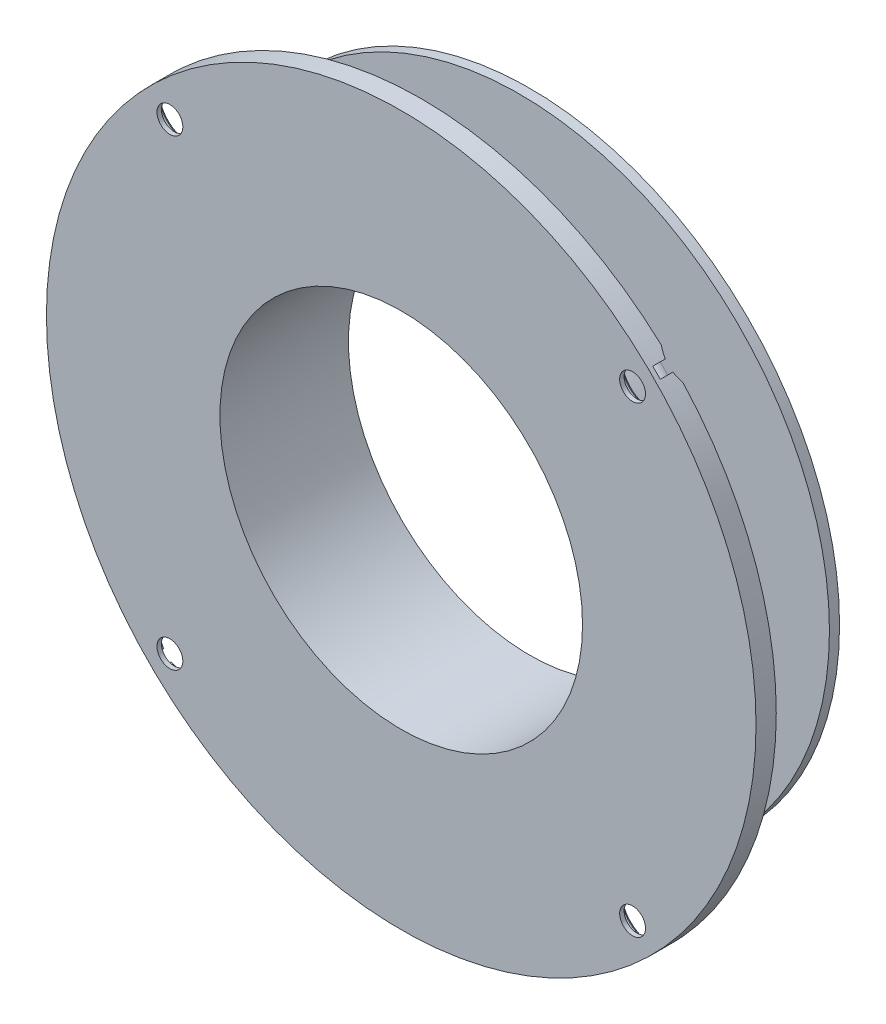
ISO-10303-21;
HEADER;
FILE_DESCRIPTION(('STEP AP214'),'2;1');
FILE_NAME('part.step','',(''),(''),'','','');
FILE_SCHEMA(('AUTOMOTIVE_DESIGN { 1 0 10303 214 1 1 1 1 }'));
ENDSEC;
DATA;
#1=APPLICATION_CONTEXT('core data for automotive mechanical design processes');
#2=APPLICATION_PROTOCOL_DEFINITION('international standard','automotive_design',2000,#1);
#3=PRODUCT_CONTEXT('',#1,'mechanical');
#4=PRODUCT('Part','Part','',(#3));
#5=PRODUCT_RELATED_PRODUCT_CATEGORY('part','',(#4));
#6=PRODUCT_DEFINITION_FORMATION('','',#4);
#7=PRODUCT_DEFINITION_CONTEXT('part definition',#1,'design');
#8=PRODUCT_DEFINITION('design','',#6,#7);
#9=PRODUCT_DEFINITION_SHAPE('','',#8);
#10=(LENGTH_UNIT() NAMED_UNIT(*) SI_UNIT(.MILLI.,.METRE.));
#11=(NAMED_UNIT(*) PLANE_ANGLE_UNIT() SI_UNIT($,.RADIAN.));
#12=(NAMED_UNIT(*) SI_UNIT($,.STERADIAN.) SOLID_ANGLE_UNIT());
#13=UNCERTAINTY_MEASURE_WITH_UNIT(LENGTH_MEASURE(1.E-05),#10,'distance_accuracy_value','');
#14=(GEOMETRIC_REPRESENTATION_CONTEXT(3) GLOBAL_UNCERTAINTY_ASSIGNED_CONTEXT((#13)) GLOBAL_UNIT_ASSIGNED_CONTEXT((#10,
#11,#12)) REPRESENTATION_CONTEXT('',''));
#15=CARTESIAN_POINT('',(0.,0.,0.));
#16=DIRECTION('',(0.,0.,1.));
#17=DIRECTION('',(1.,0.,0.));
#18=AXIS2_PLACEMENT_3D('',#15,#16,#17);
#19=CARTESIAN_POINT('',(36.83,0.,32.4499999999989));
#20=DIRECTION('',(0.,0.,1.));
#21=DIRECTION('',(1.,0.,0.));
#22=AXIS2_PLACEMENT_3D('',#19,#20,#21);
#23=CYLINDRICAL_SURFACE('',#22,35.83);
#24=CARTESIAN_POINT('',(36.83,0.,6.10000006399889));
#25=DIRECTION('',(0.,0.,1.));
#26=DIRECTION('',(1.,0.,0.));
#27=AXIS2_PLACEMENT_3D('',#24,#25,#26);
#28=CIRCLE('',#27,35.83);
#29=CARTESIAN_POINT('',(72.66,0.,6.10000006399889));
#30=VERTEX_POINT('',#29);
#31=EDGE_CURVE('E254',#30,#30,#28,.T.);
#32=ORIENTED_EDGE('',*,*,#31,.F.);
#33=EDGE_LOOP('',(#32));
#34=FACE_BOUND('',#33,.T.);
#35=CARTESIAN_POINT('',(36.83,0.,31.5000001279989));
#36=DIRECTION('',(0.,0.,1.));
#37=DIRECTION('',(1.,0.,0.));
#38=AXIS2_PLACEMENT_3D('',#35,#36,#37);
#39=CIRCLE('',#38,35.83);
#40=CARTESIAN_POINT('',(72.66,0.,31.5000001279989));
#41=VERTEX_POINT('',#40);
#42=EDGE_CURVE('E329',#41,#41,#39,.T.);
#43=ORIENTED_EDGE('',*,*,#42,.T.);
#44=EDGE_LOOP('',(#43));
#45=FACE_BOUND('',#44,.T.);
#46=ADVANCED_FACE('F41',(#34,#45),#23,.F.);
#47=CARTESIAN_POINT('',(-1.00000000000004,0.,6.10000006399889));
#48=DIRECTION('',(0.,0.,1.));
#49=DIRECTION('',(1.,0.,0.));
#50=AXIS2_PLACEMENT_3D('',#47,#48,#49);
#51=PLANE('',#50);
#52=CARTESIAN_POINT('',(36.83,0.,6.10000006399889));
#53=DIRECTION('',(0.,0.,1.));
#54=DIRECTION('',(1.,0.,0.));
#55=AXIS2_PLACEMENT_3D('',#52,#53,#54);
#56=CIRCLE('',#55,61.23);
#57=CARTESIAN_POINT('',(98.06,0.,6.10000006399889));
#58=VERTEX_POINT('',#57);
#59=EDGE_CURVE('E251',#58,#58,#56,.T.);
#60=ORIENTED_EDGE('',*,*,#59,.F.);
#61=EDGE_LOOP('',(#60));
#62=FACE_BOUND('',#61,.T.);
#63=ORIENTED_EDGE('',*,*,#31,.T.);
#64=EDGE_LOOP('',(#63));
#65=FACE_BOUND('',#64,.T.);
#66=ADVANCED_FACE('F318',(#62,#65),#51,.F.);
#67=CARTESIAN_POINT('',(36.83,0.,32.4499999999989));
#68=DIRECTION('',(0.,0.,1.));
#69=DIRECTION('',(1.,0.,0.));
#70=AXIS2_PLACEMENT_3D('',#67,#68,#69);
#71=CYLINDRICAL_SURFACE('',#70,61.23);
#72=CARTESIAN_POINT('',(36.83,0.,8.10000006399889));
#73=DIRECTION('',(0.,0.,1.));
#74=DIRECTION('',(1.,0.,0.));
#75=AXIS2_PLACEMENT_3D('',#72,#73,#74);
#76=CIRCLE('',#75,61.23);
#77=CARTESIAN_POINT('',(98.06,0.,8.10000006399889));
#78=VERTEX_POINT('',#77);
#79=EDGE_CURVE('E248',#78,#78,#76,.T.);
#80=ORIENTED_EDGE('',*,*,#79,.F.);
#81=EDGE_LOOP('',(#80));
#82=FACE_BOUND('',#81,.T.);
#83=ORIENTED_EDGE('',*,*,#59,.T.);
#84=EDGE_LOOP('',(#83));
#85=FACE_BOUND('',#84,.T.);
#86=ADVANCED_FACE('F323',(#82,#85),#71,.T.);
#87=CARTESIAN_POINT('',(-24.4,0.,8.10000006399889));
#88=DIRECTION('',(0.,0.,-1.));
#89=DIRECTION('',(-1.,0.,0.));
#90=AXIS2_PLACEMENT_3D('',#87,#88,#89);
#91=PLANE('',#90);
#92=CARTESIAN_POINT('',(36.83,0.,8.10000006399889));
#93=DIRECTION('',(0.,0.,1.));
#94=DIRECTION('',(1.,0.,0.));
#95=AXIS2_PLACEMENT_3D('',#92,#93,#94);
#96=CIRCLE('',#95,40.370000064);
#97=CARTESIAN_POINT('',(77.200000064,0.,8.10000006399889));
#98=VERTEX_POINT('',#97);
#99=EDGE_CURVE('E245',#98,#98,#96,.T.);
#100=ORIENTED_EDGE('',*,*,#99,.F.);
#101=EDGE_LOOP('',(#100));
#102=FACE_BOUND('',#101,.T.);
#103=ORIENTED_EDGE('',*,*,#79,.T.);
#104=EDGE_LOOP('',(#103));
#105=FACE_BOUND('',#104,.T.);
#106=ADVANCED_FACE('F429',(#102,#105),#91,.F.);
#107=CARTESIAN_POINT('',(36.83,0.,10.6400000639989));
#108=DIRECTION('',(0.,0.,1.));
#109=DIRECTION('',(1.,0.,0.));
#110=AXIS2_PLACEMENT_3D('',#107,#108,#109);
#111=TOROIDAL_SURFACE('',#110,40.370000064,2.54);
#112=CARTESIAN_POINT('',(36.83,0.,10.6400000639989));
#113=DIRECTION('',(0.,0.,1.));
#114=DIRECTION('',(1.,0.,0.));
#115=AXIS2_PLACEMENT_3D('',#112,#113,#114);
#116=CIRCLE('',#115,37.830000064);
#117=CARTESIAN_POINT('',(74.660000064,0.,10.6400000639989));
#118=VERTEX_POINT('',#117);
#119=EDGE_CURVE('E242',#118,#118,#116,.T.);
#120=ORIENTED_EDGE('',*,*,#119,.F.);
#121=EDGE_LOOP('',(#120));
#122=FACE_BOUND('',#121,.T.);
#123=ORIENTED_EDGE('',*,*,#99,.T.);
#124=EDGE_LOOP('',(#123));
#125=FACE_BOUND('',#124,.T.);
#126=ADVANCED_FACE('F425',(#122,#125),#111,.F.);
#127=CARTESIAN_POINT('',(36.83,0.,32.4499999999989));
#128=DIRECTION('',(0.,0.,1.));
#129=DIRECTION('',(1.,0.,0.));
#130=AXIS2_PLACEMENT_3D('',#127,#128,#129);
#131=CYLINDRICAL_SURFACE('',#130,37.830000064);
#132=CARTESIAN_POINT('',(36.83,0.,24.9599999999989));
#133=DIRECTION('',(0.,0.,1.));
#134=DIRECTION('',(1.,0.,0.));
#135=AXIS2_PLACEMENT_3D('',#132,#133,#134);
#136=CIRCLE('',#135,37.830000064);
#137=CARTESIAN_POINT('',(74.660000064,0.,24.9599999999989));
#138=VERTEX_POINT('',#137);
#139=EDGE_CURVE('E239',#138,#138,#136,.T.);
#140=ORIENTED_EDGE('',*,*,#139,.F.);
#141=EDGE_LOOP('',(#140));
#142=FACE_BOUND('',#141,.T.);
#143=ORIENTED_EDGE('',*,*,#119,.T.);
#144=EDGE_LOOP('',(#143));
#145=FACE_BOUND('',#144,.T.);
#146=ADVANCED_FACE('F419',(#142,#145),#131,.T.);
#147=CARTESIAN_POINT('',(36.83,0.,24.9599999999989));
#148=DIRECTION('',(0.,0.,1.));
#149=DIRECTION('',(1.,0.,0.));
#150=AXIS2_PLACEMENT_3D('',#147,#148,#149);
#151=TOROIDAL_SURFACE('',#150,40.370000064,2.54);
#152=CARTESIAN_POINT('',(36.83,0.,27.4999999999989));
#153=DIRECTION('',(0.,0.,1.));
#154=DIRECTION('',(1.,0.,0.));
#155=AXIS2_PLACEMENT_3D('',#152,#153,#154);
#156=CIRCLE('',#155,40.370000064);
#157=CARTESIAN_POINT('',(77.200000064,0.,27.4999999999989));
#158=VERTEX_POINT('',#157);
#159=EDGE_CURVE('E235',#158,#158,#156,.T.);
#160=ORIENTED_EDGE('',*,*,#159,.F.);
#161=EDGE_LOOP('',(#160));
#162=FACE_BOUND('',#161,.T.);
#163=ORIENTED_EDGE('',*,*,#139,.T.);
#164=EDGE_LOOP('',(#163));
#165=FACE_BOUND('',#164,.T.);
#166=ADVANCED_FACE('F415',(#162,#165),#151,.F.);
#167=CARTESIAN_POINT('',(-33.29,0.,27.4999999999989));
#168=DIRECTION('',(0.,0.,1.));
#169=DIRECTION('',(1.,0.,0.));
#170=AXIS2_PLACEMENT_3D('',#167,#168,#169);
#171=PLANE('',#170);
#172=CARTESIAN_POINT('',(36.83,0.,27.4999999999989));
#173=DIRECTION('',(0.,0.,1.));
#174=DIRECTION('',(1.,0.,0.));
#175=AXIS2_PLACEMENT_3D('',#172,#173,#174);
#176=CIRCLE('',#175,70.12);
#177=CARTESIAN_POINT('',(84.2199569493348,51.6817799648988,27.4999999999989));
#178=VERTEX_POINT('',#177);
#179=CARTESIAN_POINT('',(-10.5599569493348,51.6817799648988,27.4999999999989));
#180=VERTEX_POINT('',#179);
#181=EDGE_CURVE('E227',#178,#180,#176,.T.);
#182=ORIENTED_EDGE('',*,*,#181,.F.);
#183=CARTESIAN_POINT('',(82.55,45.72,27.4999999999989));
#184=DIRECTION('',(0.,0.,-1.));
#185=DIRECTION('',(-1.,0.,0.));
#186=AXIS2_PLACEMENT_3D('',#183,#184,#185);
#187=CIRCLE('',#186,6.19125);
#188=CARTESIAN_POINT('',(88.5117799648987,47.3899569493348,27.4999999999989));
#189=VERTEX_POINT('',#188);
#190=EDGE_CURVE('E135',#189,#178,#187,.T.);
#191=ORIENTED_EDGE('',*,*,#190,.F.);
#192=CARTESIAN_POINT('',(88.5117799648987,-47.3899569493348,27.4999999999989));
#193=VERTEX_POINT('',#192);
#194=EDGE_CURVE('E230',#193,#189,#176,.T.);
#195=ORIENTED_EDGE('',*,*,#194,.F.);
#196=CARTESIAN_POINT('',(82.55,-45.72,27.4999999999989));
#197=DIRECTION('',(0.,0.,-1.));
#198=DIRECTION('',(-1.,0.,0.));
#199=AXIS2_PLACEMENT_3D('',#196,#197,#198);
#200=CIRCLE('',#199,6.19125);
#201=CARTESIAN_POINT('',(84.2199569493348,-51.6817799648988,27.4999999999989));
#202=VERTEX_POINT('',#201);
#203=EDGE_CURVE('E345',#202,#193,#200,.T.);
#204=ORIENTED_EDGE('',*,*,#203,.F.);
#205=CARTESIAN_POINT('',(-10.5599569493348,-51.6817799648988,27.4999999999989));
#206=VERTEX_POINT('',#205);
#207=EDGE_CURVE('E228',#206,#202,#176,.T.);
#208=ORIENTED_EDGE('',*,*,#207,.F.);
#209=CARTESIAN_POINT('',(-8.89000000000001,-45.72,27.4999999999989));
#210=DIRECTION('',(0.,0.,-1.));
#211=DIRECTION('',(-1.,0.,0.));
#212=AXIS2_PLACEMENT_3D('',#209,#210,#211);
#213=CIRCLE('',#212,6.19125);
#214=CARTESIAN_POINT('',(-14.8517799648988,-47.3899569493348,27.4999999999989));
#215=VERTEX_POINT('',#214);
#216=EDGE_CURVE('E226',#215,#206,#213,.T.);
#217=ORIENTED_EDGE('',*,*,#216,.F.);
#218=CARTESIAN_POINT('',(-14.8517799648988,47.3899569493348,27.4999999999989));
#219=VERTEX_POINT('',#218);
#220=EDGE_CURVE('E217',#219,#215,#176,.T.);
#221=ORIENTED_EDGE('',*,*,#220,.F.);
#222=CARTESIAN_POINT('',(-8.89000000000001,45.72,27.4999999999989));
#223=DIRECTION('',(0.,0.,-1.));
#224=DIRECTION('',(-1.,0.,0.));
#225=AXIS2_PLACEMENT_3D('',#222,#223,#224);
#226=CIRCLE('',#225,6.19125);
#227=EDGE_CURVE('E224',#180,#219,#226,.T.);
#228=ORIENTED_EDGE('',*,*,#227,.F.);
#229=EDGE_LOOP('',(#182,#191,#195,#204,#208,#217,#221,#228));
#230=FACE_BOUND('',#229,.T.);
#231=ORIENTED_EDGE('',*,*,#159,.T.);
#232=EDGE_LOOP('',(#231));
#233=FACE_BOUND('',#232,.T.);
#234=ADVANCED_FACE('F222',(#230,#233),#171,.F.);
#235=CARTESIAN_POINT('',(36.83,0.,32.4499999999989));
#236=DIRECTION('',(0.,0.,1.));
#237=DIRECTION('',(1.,0.,0.));
#238=AXIS2_PLACEMENT_3D('',#235,#236,#237);
#239=CYLINDRICAL_SURFACE('',#238,70.12);
#240=CARTESIAN_POINT('',(36.83,0.,31.5000001279989));
#241=DIRECTION('',(0.,0.,1.));
#242=DIRECTION('',(1.,0.,0.));
#243=AXIS2_PLACEMENT_3D('',#240,#241,#242);
#244=CIRCLE('',#243,70.12);
#245=CARTESIAN_POINT('',(106.95,0.,31.5000001279989));
#246=VERTEX_POINT('',#245);
#247=EDGE_CURVE('E231',#246,#246,#244,.T.);
#248=ORIENTED_EDGE('',*,*,#247,.F.);
#249=EDGE_LOOP('',(#248));
#250=FACE_BOUND('',#249,.T.);
#251=DIRECTION('',(0.,0.,-1.));
#252=VECTOR('',#251,1.);
#253=CARTESIAN_POINT('',(85.6568963507253,50.3264204246193,29.3795999999989));
#254=LINE('',#253,#252);
#255=CARTESIAN_POINT('',(85.6568963507253,50.3264204246193,30.6241999999989));
#256=VERTEX_POINT('',#255);
#257=CARTESIAN_POINT('',(85.6568963507253,50.3264204246193,28.1349999999989));
#258=VERTEX_POINT('',#257);
#259=EDGE_CURVE('E54',#256,#258,#254,.T.);
#260=ORIENTED_EDGE('',*,*,#259,.T.);
#261=CARTESIAN_POINT('',(85.6577125004437,50.325628580019,28.1351999999988));
#262=CARTESIAN_POINT('',(85.5347230730982,50.4449600941361,28.1051149055231));
#263=CARTESIAN_POINT('',(85.4122541237485,50.5629059342247,28.0681213114924));
#264=CARTESIAN_POINT('',(85.1691751755298,50.7953406157074,27.9822261829294));
#265=CARTESIAN_POINT('',(85.048559735166,50.9098412988267,27.9333723916491));
#266=CARTESIAN_POINT('',(84.8091160353015,51.1355641651357,27.8254404181746));
#267=CARTESIAN_POINT('',(84.6902865043001,51.2467887407848,27.7663699250952));
#268=CARTESIAN_POINT('',(84.4538824937458,51.4665554305691,27.639336176964));
#269=CARTESIAN_POINT('',(84.3363148805386,51.5750851246067,27.5713385067813));
#270=CARTESIAN_POINT('',(84.2196308315999,51.6820789988626,27.4997999999982));
#271=B_SPLINE_CURVE_WITH_KNOTS('',3,(#261,#262,#263,#264,#265,#266,#267,#268,#269,#270),
.UNSPECIFIED.,.F.,.F.,(4,2,2,2,4),(0.,0.521642230814908,1.04121842967194,1.56040528235157,
2.08165588753383),.UNSPECIFIED.);
#272=EDGE_CURVE('E11',#258,#178,#271,.T.);
#273=ORIENTED_EDGE('',*,*,#272,.T.);
#274=ORIENTED_EDGE('',*,*,#181,.T.);
#275=CARTESIAN_POINT('',(-10.559630831601,51.6820789988617,27.4997999999989));
#276=CARTESIAN_POINT('',(-10.6763148805395,51.5750851246058,27.5713385067818));
#277=CARTESIAN_POINT('',(-10.7938824937465,51.4665554305684,27.6393361769644));
#278=CARTESIAN_POINT('',(-11.0302865043006,51.2467887407844,27.7663699250954));
#279=CARTESIAN_POINT('',(-11.1491160353018,51.1355641651355,27.8254404181747));
#280=CARTESIAN_POINT('',(-11.3885597351659,50.9098412988268,27.9333723916491));
#281=CARTESIAN_POINT('',(-11.5091751755297,50.7953406157076,27.9822261829293));
#282=CARTESIAN_POINT('',(-11.752254123748,50.5629059342252,28.0681213114922));
#283=CARTESIAN_POINT('',(-11.8747230730975,50.4449600941367,28.1051149055229));
#284=CARTESIAN_POINT('',(-11.9977125004429,50.3256285800198,28.1351999999986));
#285=B_SPLINE_CURVE_WITH_KNOTS('',3,(#275,#276,#277,#278,#279,#280,#281,#282,#283,#284),
.UNSPECIFIED.,.F.,.F.,(4,2,2,2,4),(0.,0.521250605181576,1.04043745786051,1.56001365671684,
2.08165588753107),.UNSPECIFIED.);
#286=CARTESIAN_POINT('',(-11.9968963507253,50.3264204246193,28.1349999999989));
#287=VERTEX_POINT('',#286);
#288=EDGE_CURVE('E192',#180,#287,#285,.T.);
#289=ORIENTED_EDGE('',*,*,#288,.T.);
#290=DIRECTION('',(0.,0.,-1.));
#291=VECTOR('',#290,1.);
#292=CARTESIAN_POINT('',(-11.9968963507253,50.3264204246193,29.3795999999989));
#293=LINE('',#292,#291);
#294=CARTESIAN_POINT('',(-11.9968963507253,50.3264204246193,30.6241999999989));
#295=VERTEX_POINT('',#294);
#296=EDGE_CURVE('E200',#287,#295,#293,.F.);
#297=ORIENTED_EDGE('',*,*,#296,.T.);
#298=CARTESIAN_POINT('',(36.83,0.,30.6241999999989));
#299=DIRECTION('',(0.,0.,1.));
#300=DIRECTION('',(1.,0.,0.));
#301=AXIS2_PLACEMENT_3D('',#298,#299,#300);
#302=CIRCLE('',#301,70.12);
#303=CARTESIAN_POINT('',(-13.4964204246193,48.8268963507253,30.6241999999989));
#304=VERTEX_POINT('',#303);
#305=EDGE_CURVE('E210',#295,#304,#302,.T.);
#306=ORIENTED_EDGE('',*,*,#305,.T.);
#307=DIRECTION('',(0.,0.,-1.));
#308=VECTOR('',#307,1.);
#309=CARTESIAN_POINT('',(-13.4964204246193,48.8268963507253,29.3795999999989));
#310=LINE('',#309,#308);
#311=CARTESIAN_POINT('',(-13.4964204246193,48.8268963507253,28.1349999999989));
#312=VERTEX_POINT('',#311);
#313=EDGE_CURVE('E212',#304,#312,#310,.T.);
#314=ORIENTED_EDGE('',*,*,#313,.T.);
#315=CARTESIAN_POINT('',(-13.4956285800185,48.8277125004442,28.1351999999989));
#316=CARTESIAN_POINT('',(-13.6149600941355,48.7047230730987,28.1051149055233));
#317=CARTESIAN_POINT('',(-13.7329059342241,48.582254123749,28.0681213114925));
#318=CARTESIAN_POINT('',(-13.9653406157068,48.3391751755305,27.9822261829297));
#319=CARTESIAN_POINT('',(-14.079841298826,48.2185597351667,27.9333723916494));
#320=CARTESIAN_POINT('',(-14.305564165135,47.9791160353023,27.825440418175));
#321=CARTESIAN_POINT('',(-14.416788740784,47.860286504301,27.7663699250956));
#322=CARTESIAN_POINT('',(-14.6365554305682,47.6238824937467,27.6393361769645));
#323=CARTESIAN_POINT('',(-14.7450851246058,47.5063148805396,27.5713385067819));
#324=CARTESIAN_POINT('',(-14.8520789988617,47.389630831601,27.4997999999989));
#325=B_SPLINE_CURVE_WITH_KNOTS('',3,(#315,#316,#317,#318,#319,#320,#321,#322,#323,#324),
.UNSPECIFIED.,.F.,.F.,(4,2,2,2,4),(0.,0.521642230814689,1.04121842967149,1.5604052823509,
2.08165588753295),.UNSPECIFIED.);
#326=EDGE_CURVE('E160',#312,#219,#325,.T.);
#327=ORIENTED_EDGE('',*,*,#326,.T.);
#328=ORIENTED_EDGE('',*,*,#220,.T.);
#329=CARTESIAN_POINT('',(-14.8520789988617,-47.389630831601,27.4997999999989));
#330=CARTESIAN_POINT('',(-14.7450851246058,-47.5063148805396,27.5713385067819));
#331=CARTESIAN_POINT('',(-14.6365554305682,-47.6238824937467,27.6393361769645));
#332=CARTESIAN_POINT('',(-14.416788740784,-47.860286504301,27.7663699250956));
#333=CARTESIAN_POINT('',(-14.305564165135,-47.9791160353023,27.825440418175));
#334=CARTESIAN_POINT('',(-14.0798412988261,-48.2185597351667,27.9333723916494));
#335=CARTESIAN_POINT('',(-13.9653406157068,-48.3391751755305,27.9822261829297));
#336=CARTESIAN_POINT('',(-13.7329059342242,-48.582254123749,28.0681213114925));
#337=CARTESIAN_POINT('',(-13.6149600941356,-48.7047230730987,28.1051149055233));
#338=CARTESIAN_POINT('',(-13.4956285800185,-48.8277125004441,28.1351999999989));
#339=B_SPLINE_CURVE_WITH_KNOTS('',3,(#329,#330,#331,#332,#333,#334,#335,#336,#337,#338),
.UNSPECIFIED.,.F.,.F.,(4,2,2,2,4),(0.,0.521250605182041,1.04043745786143,1.56001365671822,
2.0816558875329),.UNSPECIFIED.);
#340=CARTESIAN_POINT('',(-13.4964204246193,-48.8268963507253,28.1349999999989));
#341=VERTEX_POINT('',#340);
#342=EDGE_CURVE('E288',#215,#341,#339,.T.);
#343=ORIENTED_EDGE('',*,*,#342,.T.);
#344=DIRECTION('',(0.,0.,-1.));
#345=VECTOR('',#344,1.);
#346=CARTESIAN_POINT('',(-13.4964204246193,-48.8268963507253,29.3795999999989));
#347=LINE('',#346,#345);
#348=CARTESIAN_POINT('',(-13.4964204246193,-48.8268963507253,30.6241999999989));
#349=VERTEX_POINT('',#348);
#350=EDGE_CURVE('E295',#341,#349,#347,.F.);
#351=ORIENTED_EDGE('',*,*,#350,.T.);
#352=CARTESIAN_POINT('',(36.83,0.,30.6241999999989));
#353=DIRECTION('',(0.,0.,1.));
#354=DIRECTION('',(1.,0.,0.));
#355=AXIS2_PLACEMENT_3D('',#352,#353,#354);
#356=CIRCLE('',#355,70.12);
#357=CARTESIAN_POINT('',(-11.9968963507253,-50.3264204246193,30.6241999999989));
#358=VERTEX_POINT('',#357);
#359=EDGE_CURVE('E589',#349,#358,#356,.T.);
#360=ORIENTED_EDGE('',*,*,#359,.T.);
#361=DIRECTION('',(0.,0.,-1.));
#362=VECTOR('',#361,1.);
#363=CARTESIAN_POINT('',(-11.9968963507253,-50.3264204246193,29.3795999999989));
#364=LINE('',#363,#362);
#365=CARTESIAN_POINT('',(-11.9968963507253,-50.3264204246193,28.1349999999989));
#366=VERTEX_POINT('',#365);
#367=EDGE_CURVE('E588',#358,#366,#364,.T.);
#368=ORIENTED_EDGE('',*,*,#367,.T.);
#369=CARTESIAN_POINT('',(-11.9977125004428,-50.3256285800198,28.1351999999986));
#370=CARTESIAN_POINT('',(-11.8747230730975,-50.4449600941367,28.1051149055229));
#371=CARTESIAN_POINT('',(-11.7522541237479,-50.5629059342252,28.0681213114922));
#372=CARTESIAN_POINT('',(-11.5091751755296,-50.7953406157076,27.9822261829293));
#373=CARTESIAN_POINT('',(-11.3885597351659,-50.9098412988268,27.9333723916491));
#374=CARTESIAN_POINT('',(-11.1491160353018,-51.1355641651355,27.8254404181747));
#375=CARTESIAN_POINT('',(-11.0302865043006,-51.2467887407844,27.7663699250954));
#376=CARTESIAN_POINT('',(-10.7938824937465,-51.4665554305684,27.6393361769644));
#377=CARTESIAN_POINT('',(-10.6763148805395,-51.5750851246059,27.5713385067818));
#378=CARTESIAN_POINT('',(-10.559630831601,-51.6820789988617,27.4997999999989));
#379=B_SPLINE_CURVE_WITH_KNOTS('',3,(#369,#370,#371,#372,#373,#374,#375,#376,#377,#378),
.UNSPECIFIED.,.F.,.F.,(4,2,2,2,4),(0.,0.521642230814211,1.04121842967055,1.56040528234948,
2.08165588753106),.UNSPECIFIED.);
#380=EDGE_CURVE('E201',#366,#206,#379,.T.);
#381=ORIENTED_EDGE('',*,*,#380,.T.);
#382=ORIENTED_EDGE('',*,*,#207,.T.);
#383=CARTESIAN_POINT('',(84.2196308315999,-51.6820789988626,27.4997999999982));
#384=CARTESIAN_POINT('',(84.3363148805386,-51.5750851246067,27.5713385067813));
#385=CARTESIAN_POINT('',(84.4538824937458,-51.466555430569,27.639336176964));
#386=CARTESIAN_POINT('',(84.6902865043003,-51.2467887407847,27.7663699250953));
#387=CARTESIAN_POINT('',(84.8091160353017,-51.1355641651355,27.8254404181747));
#388=CARTESIAN_POINT('',(85.0485597351662,-50.9098412988265,27.9333723916492));
#389=CARTESIAN_POINT('',(85.1691751755302,-50.7953406157071,27.9822261829295));
#390=CARTESIAN_POINT('',(85.4122541237489,-50.5629059342243,28.0681213114925));
#391=CARTESIAN_POINT('',(85.5347230730987,-50.4449600941356,28.1051149055233));
#392=CARTESIAN_POINT('',(85.6577125004442,-50.3256285800184,28.1351999999989));
#393=B_SPLINE_CURVE_WITH_KNOTS('',3,(#383,#384,#385,#386,#387,#388,#389,#390,#391,#392),
.UNSPECIFIED.,.F.,.F.,(4,2,2,2,4),(0.,0.521250605182467,1.04043745786226,1.56001365671948,
2.08165588753457),.UNSPECIFIED.);
#394=CARTESIAN_POINT('',(85.6568963507252,-50.3264204246193,28.1349999999989));
#395=VERTEX_POINT('',#394);
#396=EDGE_CURVE('E257',#202,#395,#393,.T.);
#397=ORIENTED_EDGE('',*,*,#396,.T.);
#398=DIRECTION('',(0.,0.,-1.));
#399=VECTOR('',#398,1.);
#400=CARTESIAN_POINT('',(85.6568963507253,-50.3264204246193,29.3795999999989));
#401=LINE('',#400,#399);
#402=CARTESIAN_POINT('',(85.6568963507253,-50.3264204246193,30.6241999999989));
#403=VERTEX_POINT('',#402);
#404=EDGE_CURVE('E265',#395,#403,#401,.F.);
#405=ORIENTED_EDGE('',*,*,#404,.T.);
#406=CARTESIAN_POINT('',(36.83,0.,30.6241999999989));
#407=DIRECTION('',(0.,0.,1.));
#408=DIRECTION('',(1.,0.,0.));
#409=AXIS2_PLACEMENT_3D('',#406,#407,#408);
#410=CIRCLE('',#409,70.12);
#411=CARTESIAN_POINT('',(87.1564204246193,-48.8268963507253,30.6241999999989));
#412=VERTEX_POINT('',#411);
#413=EDGE_CURVE('E583',#403,#412,#410,.T.);
#414=ORIENTED_EDGE('',*,*,#413,.T.);
#415=DIRECTION('',(0.,0.,-1.));
#416=VECTOR('',#415,1.);
#417=CARTESIAN_POINT('',(87.1564204246193,-48.8268963507253,29.3795999999989));
#418=LINE('',#417,#416);
#419=CARTESIAN_POINT('',(87.1564204246193,-48.8268963507253,28.1349999999989));
#420=VERTEX_POINT('',#419);
#421=EDGE_CURVE('E289',#412,#420,#418,.T.);
#422=ORIENTED_EDGE('',*,*,#421,.T.);
#423=CARTESIAN_POINT('',(87.1556285800197,-48.8277125004429,28.1351999999986));
#424=CARTESIAN_POINT('',(87.2749600941367,-48.7047230730976,28.1051149055229));
#425=CARTESIAN_POINT('',(87.3929059342251,-48.582254123748,28.0681213114922));
#426=CARTESIAN_POINT('',(87.6253406157076,-48.3391751755297,27.9822261829293));
#427=CARTESIAN_POINT('',(87.7398412988267,-48.218559735166,27.9333723916491));
#428=CARTESIAN_POINT('',(87.9655641651354,-47.9791160353018,27.8254404181747));
#429=CARTESIAN_POINT('',(88.0767887407844,-47.8602865043006,27.7663699250954));
#430=CARTESIAN_POINT('',(88.2965554305684,-47.6238824937465,27.6393361769644));
#431=CARTESIAN_POINT('',(88.4050851246058,-47.5063148805395,27.5713385067818));
#432=CARTESIAN_POINT('',(88.5120789988617,-47.389630831601,27.4997999999989));
#433=B_SPLINE_CURVE_WITH_KNOTS('',3,(#423,#424,#425,#426,#427,#428,#429,#430,#431,#432),
.UNSPECIFIED.,.F.,.F.,(4,2,2,2,4),(0.,0.52164223081422,1.04121842967057,1.56040528234952,
2.0816558875311),.UNSPECIFIED.);
#434=EDGE_CURVE('E280',#420,#193,#433,.T.);
#435=ORIENTED_EDGE('',*,*,#434,.T.);
#436=ORIENTED_EDGE('',*,*,#194,.T.);
#437=CARTESIAN_POINT('',(88.5120789988626,47.3896308315999,27.4997999999982));
#438=CARTESIAN_POINT('',(88.4050851246068,47.5063148805385,27.5713385067812));
#439=CARTESIAN_POINT('',(88.2965554305693,47.6238824937456,27.6393361769639));
#440=CARTESIAN_POINT('',(88.0767887407852,47.8602865042997,27.766369925095));
#441=CARTESIAN_POINT('',(87.9655641651362,47.979116035301,27.8254404181743));
#442=CARTESIAN_POINT('',(87.7398412988274,48.2185597351652,27.9333723916487));
#443=CARTESIAN_POINT('',(87.6253406157083,48.339175175529,27.9822261829291));
#444=CARTESIAN_POINT('',(87.3929059342257,48.5822541237474,28.068121311492));
#445=CARTESIAN_POINT('',(87.2749600941372,48.704723073097,28.1051149055228));
#446=CARTESIAN_POINT('',(87.1556285800202,48.8277125004424,28.1351999999984));
#447=B_SPLINE_CURVE_WITH_KNOTS('',3,(#437,#438,#439,#440,#441,#442,#443,#444,#445,#446),
.UNSPECIFIED.,.F.,.F.,(4,2,2,2,4),(0.,0.521250605181796,1.04043745786095,1.56001365671749,
2.08165588753193),.UNSPECIFIED.);
#448=CARTESIAN_POINT('',(87.1564204246193,48.8268963507253,28.1349999999989));
#449=VERTEX_POINT('',#448);
#450=EDGE_CURVE('E154',#189,#449,#447,.T.);
#451=ORIENTED_EDGE('',*,*,#450,.T.);
#452=DIRECTION('',(0.,0.,-1.));
#453=VECTOR('',#452,1.);
#454=CARTESIAN_POINT('',(87.1564204246193,48.8268963507253,29.3795999999989));
#455=LINE('',#454,#453);
#456=CARTESIAN_POINT('',(87.1564204246193,48.8268963507253,30.6241999999989));
#457=VERTEX_POINT('',#456);
#458=EDGE_CURVE('E144',#449,#457,#455,.F.);
#459=ORIENTED_EDGE('',*,*,#458,.T.);
#460=CARTESIAN_POINT('',(36.83,0.,30.6241999999989));
#461=DIRECTION('',(0.,0.,1.));
#462=DIRECTION('',(1.,0.,0.));
#463=AXIS2_PLACEMENT_3D('',#460,#461,#462);
#464=CIRCLE('',#463,70.12);
#465=EDGE_CURVE('E150',#457,#256,#464,.T.);
#466=ORIENTED_EDGE('',*,*,#465,.T.);
#467=EDGE_LOOP('',(#260,#273,#274,#289,#297,#306,#314,#327,#328,#343,#351,#360,#368,#381,#382,
#397,#405,#414,#422,#435,#436,#451,#459,#466));
#468=FACE_BOUND('',#467,.T.);
#469=ADVANCED_FACE('F149',(#250,#468),#239,.T.);
#470=CARTESIAN_POINT('',(0.999999999999963,0.,31.5000001279989));
#471=DIRECTION('',(0.,0.,-1.));
#472=DIRECTION('',(-1.,0.,0.));
#473=AXIS2_PLACEMENT_3D('',#470,#471,#472);
#474=PLANE('',#473);
#475=CARTESIAN_POINT('',(82.55,45.72,31.5000001279989));
#476=DIRECTION('',(0.,0.,-1.));
#477=DIRECTION('',(-1.,0.,0.));
#478=AXIS2_PLACEMENT_3D('',#475,#476,#477);
#479=CIRCLE('',#478,2.55270000000001);
#480=CARTESIAN_POINT('',(79.9973,45.72,31.5000001279989));
#481=VERTEX_POINT('',#480);
#482=EDGE_CURVE('E371',#481,#481,#479,.T.);
#483=ORIENTED_EDGE('',*,*,#482,.T.);
#484=EDGE_LOOP('',(#483));
#485=FACE_BOUND('',#484,.T.);
#486=CARTESIAN_POINT('',(-8.89000000000001,45.72,31.5000001279989));
#487=DIRECTION('',(0.,0.,-1.));
#488=DIRECTION('',(-1.,0.,0.));
#489=AXIS2_PLACEMENT_3D('',#486,#487,#488);
#490=CIRCLE('',#489,2.5527);
#491=CARTESIAN_POINT('',(-11.4427,45.72,31.5000001279989));
#492=VERTEX_POINT('',#491);
#493=EDGE_CURVE('E360',#492,#492,#490,.T.);
#494=ORIENTED_EDGE('',*,*,#493,.T.);
#495=EDGE_LOOP('',(#494));
#496=FACE_BOUND('',#495,.T.);
#497=CARTESIAN_POINT('',(-8.89000000000001,-45.72,31.5000001279989));
#498=DIRECTION('',(0.,0.,-1.));
#499=DIRECTION('',(-1.,0.,0.));
#500=AXIS2_PLACEMENT_3D('',#497,#498,#499);
#501=CIRCLE('',#500,2.5527);
#502=CARTESIAN_POINT('',(-11.4427,-45.72,31.5000001279989));
#503=VERTEX_POINT('',#502);
#504=EDGE_CURVE('E347',#503,#503,#501,.T.);
#505=ORIENTED_EDGE('',*,*,#504,.T.);
#506=EDGE_LOOP('',(#505));
#507=FACE_BOUND('',#506,.T.);
#508=CARTESIAN_POINT('',(82.55,-45.72,31.5000001279989));
#509=DIRECTION('',(0.,0.,-1.));
#510=DIRECTION('',(-1.,0.,0.));
#511=AXIS2_PLACEMENT_3D('',#508,#509,#510);
#512=CIRCLE('',#511,2.55270000000001);
#513=CARTESIAN_POINT('',(79.9973,-45.72,31.5000001279989));
#514=VERTEX_POINT('',#513);
#515=EDGE_CURVE('E331',#514,#514,#512,.T.);
#516=ORIENTED_EDGE('',*,*,#515,.T.);
#517=EDGE_LOOP('',(#516));
#518=FACE_BOUND('',#517,.T.);
#519=ORIENTED_EDGE('',*,*,#42,.F.);
#520=EDGE_LOOP('',(#519));
#521=FACE_BOUND('',#520,.T.);
#522=ORIENTED_EDGE('',*,*,#247,.T.);
#523=EDGE_LOOP('',(#522));
#524=FACE_BOUND('',#523,.T.);
#525=ADVANCED_FACE('F400',(#485,#496,#507,#518,#521,#524),#474,.F.);
#526=CARTESIAN_POINT('',(88.10625,-45.72,30.6241999999989));
#527=DIRECTION('',(0.,0.,1.));
#528=DIRECTION('',(1.,0.,0.));
#529=AXIS2_PLACEMENT_3D('',#526,#527,#528);
#530=PLANE('',#529);
#531=CARTESIAN_POINT('',(82.55,-45.72,30.6241999999989));
#532=DIRECTION('',(0.,0.,-1.));
#533=DIRECTION('',(-1.,0.,0.));
#534=AXIS2_PLACEMENT_3D('',#531,#532,#533);
#535=CIRCLE('',#534,2.55270000000001);
#536=CARTESIAN_POINT('',(79.9973,-45.72,30.6241999999989));
#537=VERTEX_POINT('',#536);
#538=EDGE_CURVE('E334',#537,#537,#535,.T.);
#539=ORIENTED_EDGE('',*,*,#538,.F.);
#540=EDGE_LOOP('',(#539));
#541=FACE_BOUND('',#540,.T.);
#542=CARTESIAN_POINT('',(82.55,-45.72,30.6241999999989));
#543=DIRECTION('',(0.,0.,-1.));
#544=DIRECTION('',(-1.,0.,0.));
#545=AXIS2_PLACEMENT_3D('',#542,#543,#544);
#546=CIRCLE('',#545,5.55625);
#547=EDGE_CURVE('E339',#403,#412,#546,.T.);
#548=ORIENTED_EDGE('',*,*,#547,.T.);
#549=ORIENTED_EDGE('',*,*,#413,.F.);
#550=EDGE_LOOP('',(#548,#549));
#551=FACE_BOUND('',#550,.T.);
#552=ADVANCED_FACE('F403',(#541,#551),#530,.F.);
#553=CARTESIAN_POINT('',(82.55,-45.72,27.4999999999989));
#554=DIRECTION('',(0.,0.,-1.));
#555=DIRECTION('',(-1.,0.,0.));
#556=AXIS2_PLACEMENT_3D('',#553,#554,#555);
#557=CYLINDRICAL_SURFACE('',#556,5.55625);
#558=ORIENTED_EDGE('',*,*,#547,.F.);
#559=ORIENTED_EDGE('',*,*,#404,.F.);
#560=CARTESIAN_POINT('',(82.55,-45.72,28.1349999999989));
#561=DIRECTION('',(0.,0.,-1.));
#562=DIRECTION('',(-1.,0.,0.));
#563=AXIS2_PLACEMENT_3D('',#560,#561,#562);
#564=CIRCLE('',#563,5.55625);
#565=EDGE_CURVE('E342',#395,#420,#564,.T.);
#566=ORIENTED_EDGE('',*,*,#565,.T.);
#567=ORIENTED_EDGE('',*,*,#421,.F.);
#568=EDGE_LOOP('',(#558,#559,#566,#567));
#569=FACE_BOUND('',#568,.T.);
#570=ADVANCED_FACE('F273',(#569),#557,.F.);
#571=CARTESIAN_POINT('',(82.55,-45.72,27.4999999999989));
#572=DIRECTION('',(0.,0.,-1.));
#573=DIRECTION('',(-1.,0.,0.));
#574=AXIS2_PLACEMENT_3D('',#571,#572,#573);
#575=CONICAL_SURFACE('',#574,6.19125,0.785398163397446);
#576=ORIENTED_EDGE('',*,*,#565,.F.);
#577=ORIENTED_EDGE('',*,*,#396,.F.);
#578=ORIENTED_EDGE('',*,*,#203,.T.);
#579=ORIENTED_EDGE('',*,*,#434,.F.);
#580=EDGE_LOOP('',(#576,#577,#578,#579));
#581=FACE_BOUND('',#580,.T.);
#582=ADVANCED_FACE('F267',(#581),#575,.F.);
#583=CARTESIAN_POINT('',(82.55,-45.72,27.4999999999989));
#584=DIRECTION('',(0.,0.,-1.));
#585=DIRECTION('',(-1.,0.,0.));
#586=AXIS2_PLACEMENT_3D('',#583,#584,#585);
#587=CYLINDRICAL_SURFACE('',#586,2.55270000000001);
#588=ORIENTED_EDGE('',*,*,#515,.F.);
#589=EDGE_LOOP('',(#588));
#590=FACE_BOUND('',#589,.T.);
#591=ORIENTED_EDGE('',*,*,#538,.T.);
#592=EDGE_LOOP('',(#591));
#593=FACE_BOUND('',#592,.T.);
#594=ADVANCED_FACE('F272',(#590,#593),#587,.F.);
#595=CARTESIAN_POINT('',(-3.33375000000001,-45.72,30.6241999999989));
#596=DIRECTION('',(0.,0.,1.));
#597=DIRECTION('',(1.,0.,0.));
#598=AXIS2_PLACEMENT_3D('',#595,#596,#597);
#599=PLANE('',#598);
#600=CARTESIAN_POINT('',(-8.89000000000001,-45.72,30.6241999999989));
#601=DIRECTION('',(0.,0.,-1.));
#602=DIRECTION('',(-1.,0.,0.));
#603=AXIS2_PLACEMENT_3D('',#600,#601,#602);
#604=CIRCLE('',#603,2.5527);
#605=CARTESIAN_POINT('',(-11.4427,-45.72,30.6241999999989));
#606=VERTEX_POINT('',#605);
#607=EDGE_CURVE('E350',#606,#606,#604,.T.);
#608=ORIENTED_EDGE('',*,*,#607,.F.);
#609=EDGE_LOOP('',(#608));
#610=FACE_BOUND('',#609,.T.);
#611=CARTESIAN_POINT('',(-8.89000000000001,-45.72,30.6241999999989));
#612=DIRECTION('',(0.,0.,-1.));
#613=DIRECTION('',(-1.,0.,0.));
#614=AXIS2_PLACEMENT_3D('',#611,#612,#613);
#615=CIRCLE('',#614,5.55625);
#616=EDGE_CURVE('E353',#349,#358,#615,.T.);
#617=ORIENTED_EDGE('',*,*,#616,.T.);
#618=ORIENTED_EDGE('',*,*,#359,.F.);
#619=EDGE_LOOP('',(#617,#618));
#620=FACE_BOUND('',#619,.T.);
#621=ADVANCED_FACE('F306',(#610,#620),#599,.F.);
#622=CARTESIAN_POINT('',(-8.89000000000001,-45.72,27.4999999999989));
#623=DIRECTION('',(0.,0.,-1.));
#624=DIRECTION('',(-1.,0.,0.));
#625=AXIS2_PLACEMENT_3D('',#622,#623,#624);
#626=CYLINDRICAL_SURFACE('',#625,5.55625);
#627=ORIENTED_EDGE('',*,*,#616,.F.);
#628=ORIENTED_EDGE('',*,*,#350,.F.);
#629=CARTESIAN_POINT('',(-8.89000000000001,-45.72,28.1349999999989));
#630=DIRECTION('',(0.,0.,-1.));
#631=DIRECTION('',(-1.,0.,0.));
#632=AXIS2_PLACEMENT_3D('',#629,#630,#631);
#633=CIRCLE('',#632,5.55625);
#634=EDGE_CURVE('E356',#341,#366,#633,.T.);
#635=ORIENTED_EDGE('',*,*,#634,.T.);
#636=ORIENTED_EDGE('',*,*,#367,.F.);
#637=EDGE_LOOP('',(#627,#628,#635,#636));
#638=FACE_BOUND('',#637,.T.);
#639=ADVANCED_FACE('F302',(#638),#626,.F.);
#640=CARTESIAN_POINT('',(-8.89000000000001,-45.72,27.4999999999989));
#641=DIRECTION('',(0.,0.,-1.));
#642=DIRECTION('',(-1.,0.,0.));
#643=AXIS2_PLACEMENT_3D('',#640,#641,#642);
#644=CONICAL_SURFACE('',#643,6.19125,0.785398163397449);
#645=ORIENTED_EDGE('',*,*,#634,.F.);
#646=ORIENTED_EDGE('',*,*,#342,.F.);
#647=ORIENTED_EDGE('',*,*,#216,.T.);
#648=ORIENTED_EDGE('',*,*,#380,.F.);
#649=EDGE_LOOP('',(#645,#646,#647,#648));
#650=FACE_BOUND('',#649,.T.);
#651=ADVANCED_FACE('F297',(#650),#644,.F.);
#652=CARTESIAN_POINT('',(-8.89000000000001,-45.72,27.4999999999989));
#653=DIRECTION('',(0.,0.,-1.));
#654=DIRECTION('',(-1.,0.,0.));
#655=AXIS2_PLACEMENT_3D('',#652,#653,#654);
#656=CYLINDRICAL_SURFACE('',#655,2.5527);
#657=ORIENTED_EDGE('',*,*,#504,.F.);
#658=EDGE_LOOP('',(#657));
#659=FACE_BOUND('',#658,.T.);
#660=ORIENTED_EDGE('',*,*,#607,.T.);
#661=EDGE_LOOP('',(#660));
#662=FACE_BOUND('',#661,.T.);
#663=ADVANCED_FACE('F275',(#659,#662),#656,.F.);
#664=CARTESIAN_POINT('',(-3.33375000000001,45.72,30.6241999999989));
#665=DIRECTION('',(0.,0.,1.));
#666=DIRECTION('',(1.,0.,0.));
#667=AXIS2_PLACEMENT_3D('',#664,#665,#666);
#668=PLANE('',#667);
#669=CARTESIAN_POINT('',(-8.89000000000001,45.72,30.6241999999989));
#670=DIRECTION('',(0.,0.,-1.));
#671=DIRECTION('',(-1.,0.,0.));
#672=AXIS2_PLACEMENT_3D('',#669,#670,#671);
#673=CIRCLE('',#672,2.5527);
#674=CARTESIAN_POINT('',(-11.4427,45.72,30.6241999999989));
#675=VERTEX_POINT('',#674);
#676=EDGE_CURVE('E363',#675,#675,#673,.T.);
#677=ORIENTED_EDGE('',*,*,#676,.F.);
#678=EDGE_LOOP('',(#677));
#679=FACE_BOUND('',#678,.T.);
#680=CARTESIAN_POINT('',(-8.89000000000001,45.72,30.6241999999989));
#681=DIRECTION('',(0.,0.,-1.));
#682=DIRECTION('',(-1.,0.,0.));
#683=AXIS2_PLACEMENT_3D('',#680,#681,#682);
#684=CIRCLE('',#683,5.55625);
#685=EDGE_CURVE('E366',#295,#304,#684,.T.);
#686=ORIENTED_EDGE('',*,*,#685,.T.);
#687=ORIENTED_EDGE('',*,*,#305,.F.);
#688=EDGE_LOOP('',(#686,#687));
#689=FACE_BOUND('',#688,.T.);
#690=ADVANCED_FACE('F384',(#679,#689),#668,.F.);
#691=CARTESIAN_POINT('',(-8.89000000000001,45.72,27.4999999999989));
#692=DIRECTION('',(0.,0.,-1.));
#693=DIRECTION('',(-1.,0.,0.));
#694=AXIS2_PLACEMENT_3D('',#691,#692,#693);
#695=CYLINDRICAL_SURFACE('',#694,5.55625);
#696=ORIENTED_EDGE('',*,*,#685,.F.);
#697=ORIENTED_EDGE('',*,*,#296,.F.);
#698=CARTESIAN_POINT('',(-8.89000000000001,45.72,28.1349999999989));
#699=DIRECTION('',(0.,0.,-1.));
#700=DIRECTION('',(-1.,0.,0.));
#701=AXIS2_PLACEMENT_3D('',#698,#699,#700);
#702=CIRCLE('',#701,5.55625);
#703=EDGE_CURVE('E69',#287,#312,#702,.T.);
#704=ORIENTED_EDGE('',*,*,#703,.T.);
#705=ORIENTED_EDGE('',*,*,#313,.F.);
#706=EDGE_LOOP('',(#696,#697,#704,#705));
#707=FACE_BOUND('',#706,.T.);
#708=ADVANCED_FACE('F188',(#707),#695,.F.);
#709=CARTESIAN_POINT('',(-8.89000000000001,45.72,27.4999999999989));
#710=DIRECTION('',(0.,0.,-1.));
#711=DIRECTION('',(-1.,0.,0.));
#712=AXIS2_PLACEMENT_3D('',#709,#710,#711);
#713=CONICAL_SURFACE('',#712,6.19125,0.785398163397449);
#714=ORIENTED_EDGE('',*,*,#703,.F.);
#715=ORIENTED_EDGE('',*,*,#288,.F.);
#716=ORIENTED_EDGE('',*,*,#227,.T.);
#717=ORIENTED_EDGE('',*,*,#326,.F.);
#718=EDGE_LOOP('',(#714,#715,#716,#717));
#719=FACE_BOUND('',#718,.T.);
#720=ADVANCED_FACE('F184',(#719),#713,.F.);
#721=CARTESIAN_POINT('',(-8.89000000000001,45.72,27.4999999999989));
#722=DIRECTION('',(0.,0.,-1.));
#723=DIRECTION('',(-1.,0.,0.));
#724=AXIS2_PLACEMENT_3D('',#721,#722,#723);
#725=CYLINDRICAL_SURFACE('',#724,2.5527);
#726=ORIENTED_EDGE('',*,*,#493,.F.);
#727=EDGE_LOOP('',(#726));
#728=FACE_BOUND('',#727,.T.);
#729=ORIENTED_EDGE('',*,*,#676,.T.);
#730=EDGE_LOOP('',(#729));
#731=FACE_BOUND('',#730,.T.);
#732=ADVANCED_FACE('F180',(#728,#731),#725,.F.);
#733=CARTESIAN_POINT('',(88.10625,45.72,30.6241999999989));
#734=DIRECTION('',(0.,0.,1.));
#735=DIRECTION('',(1.,0.,0.));
#736=AXIS2_PLACEMENT_3D('',#733,#734,#735);
#737=PLANE('',#736);
#738=CARTESIAN_POINT('',(82.55,45.72,30.6241999999989));
#739=DIRECTION('',(0.,0.,-1.));
#740=DIRECTION('',(-1.,0.,0.));
#741=AXIS2_PLACEMENT_3D('',#738,#739,#740);
#742=CIRCLE('',#741,2.55270000000001);
#743=CARTESIAN_POINT('',(79.9973,45.72,30.6241999999989));
#744=VERTEX_POINT('',#743);
#745=EDGE_CURVE('E374',#744,#744,#742,.T.);
#746=ORIENTED_EDGE('',*,*,#745,.F.);
#747=EDGE_LOOP('',(#746));
#748=FACE_BOUND('',#747,.T.);
#749=CARTESIAN_POINT('',(82.55,45.72,30.6241999999989));
#750=DIRECTION('',(0.,0.,-1.));
#751=DIRECTION('',(-1.,0.,0.));
#752=AXIS2_PLACEMENT_3D('',#749,#750,#751);
#753=CIRCLE('',#752,5.55625);
#754=EDGE_CURVE('E146',#457,#256,#753,.T.);
#755=ORIENTED_EDGE('',*,*,#754,.T.);
#756=ORIENTED_EDGE('',*,*,#465,.F.);
#757=EDGE_LOOP('',(#755,#756));
#758=FACE_BOUND('',#757,.T.);
#759=ADVANCED_FACE('F177',(#748,#758),#737,.F.);
#760=CARTESIAN_POINT('',(82.55,45.72,27.4999999999989));
#761=DIRECTION('',(0.,0.,-1.));
#762=DIRECTION('',(-1.,0.,0.));
#763=AXIS2_PLACEMENT_3D('',#760,#761,#762);
#764=CYLINDRICAL_SURFACE('',#763,5.55625);
#765=ORIENTED_EDGE('',*,*,#754,.F.);
#766=ORIENTED_EDGE('',*,*,#458,.F.);
#767=CARTESIAN_POINT('',(82.55,45.72,28.1349999999989));
#768=DIRECTION('',(0.,0.,-1.));
#769=DIRECTION('',(-1.,0.,0.));
#770=AXIS2_PLACEMENT_3D('',#767,#768,#769);
#771=CIRCLE('',#770,5.55625);
#772=EDGE_CURVE('E61',#449,#258,#771,.T.);
#773=ORIENTED_EDGE('',*,*,#772,.T.);
#774=ORIENTED_EDGE('',*,*,#259,.F.);
#775=EDGE_LOOP('',(#765,#766,#773,#774));
#776=FACE_BOUND('',#775,.T.);
#777=ADVANCED_FACE('F141',(#776),#764,.F.);
#778=CARTESIAN_POINT('',(82.55,45.72,27.4999999999989));
#779=DIRECTION('',(0.,0.,-1.));
#780=DIRECTION('',(-1.,0.,0.));
#781=AXIS2_PLACEMENT_3D('',#778,#779,#780);
#782=CONICAL_SURFACE('',#781,6.19125,0.785398163397446);
#783=ORIENTED_EDGE('',*,*,#772,.F.);
#784=ORIENTED_EDGE('',*,*,#450,.F.);
#785=ORIENTED_EDGE('',*,*,#190,.T.);
#786=ORIENTED_EDGE('',*,*,#272,.F.);
#787=EDGE_LOOP('',(#783,#784,#785,#786));
#788=FACE_BOUND('',#787,.T.);
#789=ADVANCED_FACE('F133',(#788),#782,.F.);
#790=CARTESIAN_POINT('',(82.55,45.72,27.4999999999989));
#791=DIRECTION('',(0.,0.,-1.));
#792=DIRECTION('',(-1.,0.,0.));
#793=AXIS2_PLACEMENT_3D('',#790,#791,#792);
#794=CYLINDRICAL_SURFACE('',#793,2.55270000000001);
#795=ORIENTED_EDGE('',*,*,#482,.F.);
#796=EDGE_LOOP('',(#795));
#797=FACE_BOUND('',#796,.T.);
#798=ORIENTED_EDGE('',*,*,#745,.T.);
#799=EDGE_LOOP('',(#798));
#800=FACE_BOUND('',#799,.T.);
#801=ADVANCED_FACE('F173',(#797,#800),#794,.F.);
#802=CLOSED_SHELL('',(#46,#66,#86,#106,#126,#146,#166,#234,#469,#525,#552,#570,#582,#594,#621,
#639,#651,#663,#690,#708,#720,#732,#759,#777,#789,#801));
#803=MANIFOLD_SOLID_BREP('B2',#802);
#804=ADVANCED_BREP_SHAPE_REPRESENTATION('',(#18,#803),#14);
#805=SHAPE_DEFINITION_REPRESENTATION(#9,#804);
ENDSEC;
END-ISO-10303-21;
